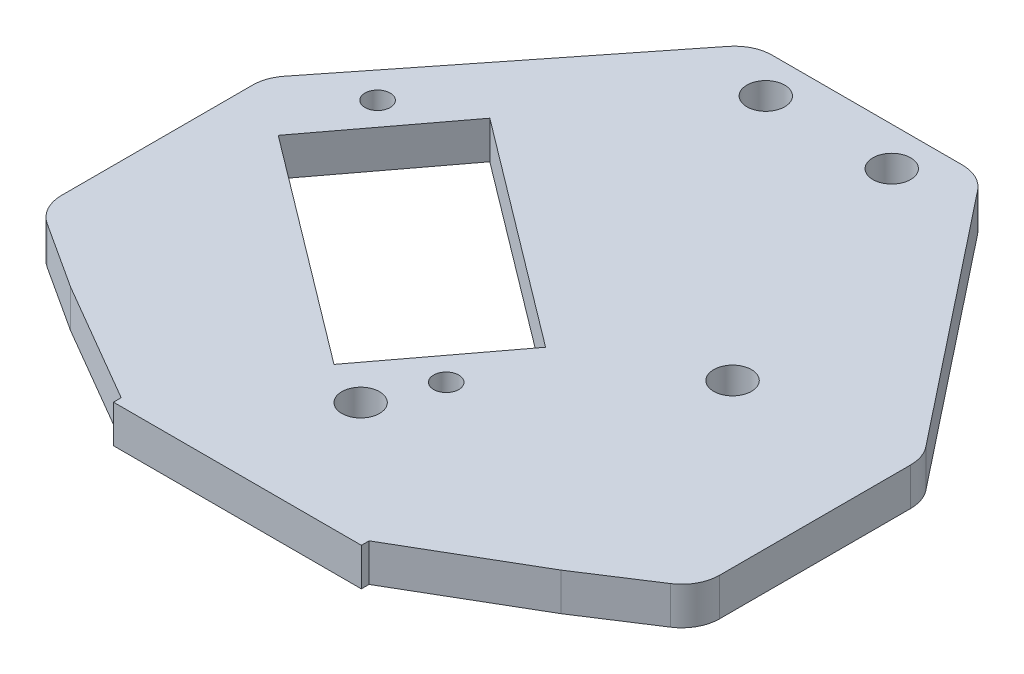
ISO-10303-21;
HEADER;
FILE_DESCRIPTION(('STEP AP214'),'2;1');
FILE_NAME('part.step','',(''),(''),'','','');
FILE_SCHEMA(('AUTOMOTIVE_DESIGN { 1 0 10303 214 1 1 1 1 }'));
ENDSEC;
DATA;
#1=APPLICATION_CONTEXT('core data for automotive mechanical design processes');
#2=APPLICATION_PROTOCOL_DEFINITION('international standard','automotive_design',2000,#1);
#3=PRODUCT_CONTEXT('',#1,'mechanical');
#4=PRODUCT('Part','Part','',(#3));
#5=PRODUCT_RELATED_PRODUCT_CATEGORY('part','',(#4));
#6=PRODUCT_DEFINITION_FORMATION('','',#4);
#7=PRODUCT_DEFINITION_CONTEXT('part definition',#1,'design');
#8=PRODUCT_DEFINITION('design','',#6,#7);
#9=PRODUCT_DEFINITION_SHAPE('','',#8);
#10=(LENGTH_UNIT() NAMED_UNIT(*) SI_UNIT(.MILLI.,.METRE.));
#11=(NAMED_UNIT(*) PLANE_ANGLE_UNIT() SI_UNIT($,.RADIAN.));
#12=(NAMED_UNIT(*) SI_UNIT($,.STERADIAN.) SOLID_ANGLE_UNIT());
#13=UNCERTAINTY_MEASURE_WITH_UNIT(LENGTH_MEASURE(1.E-05),#10,'distance_accuracy_value','');
#14=(GEOMETRIC_REPRESENTATION_CONTEXT(3) GLOBAL_UNCERTAINTY_ASSIGNED_CONTEXT((#13)) GLOBAL_UNIT_ASSIGNED_CONTEXT((#10,
#11,#12)) REPRESENTATION_CONTEXT('',''));
#15=CARTESIAN_POINT('',(0.,0.,0.));
#16=DIRECTION('',(0.,0.,1.));
#17=DIRECTION('',(1.,0.,0.));
#18=AXIS2_PLACEMENT_3D('',#15,#16,#17);
#19=CARTESIAN_POINT('',(0.,3.,0.));
#20=DIRECTION('',(0.,1.,0.));
#21=DIRECTION('',(0.,0.,1.));
#22=AXIS2_PLACEMENT_3D('',#19,#20,#21);
#23=PLANE('',#22);
#24=DIRECTION('',(1.,0.,0.));
#25=VECTOR('',#24,1.);
#26=CARTESIAN_POINT('',(0.,3.,12.4305224604994));
#27=LINE('',#26,#25);
#28=CARTESIAN_POINT('',(-9.84524580259062,3.,12.4305224604994));
#29=VERTEX_POINT('',#28);
#30=CARTESIAN_POINT('',(9.84524580259062,3.,12.4305224604994));
#31=VERTEX_POINT('',#30);
#32=EDGE_CURVE('E320',#29,#31,#27,.T.);
#33=ORIENTED_EDGE('',*,*,#32,.T.);
#34=DIRECTION('',(0.,0.,-1.));
#35=VECTOR('',#34,1.);
#36=CARTESIAN_POINT('',(9.84524580259062,3.,0.));
#37=LINE('',#36,#35);
#38=CARTESIAN_POINT('',(9.84524580259062,3.,11.8182002991371));
#39=VERTEX_POINT('',#38);
#40=EDGE_CURVE('E347',#31,#39,#37,.T.);
#41=ORIENTED_EDGE('',*,*,#40,.T.);
#42=DIRECTION('',(-0.864123910867607,0.,0.503279114077737));
#43=VECTOR('',#42,1.);
#44=CARTESIAN_POINT('',(7.63338331764616,3.,13.1064231776904));
#45=LINE('',#44,#43);
#46=CARTESIAN_POINT('',(19.4729223530017,3.,6.21089275448998));
#47=VERTEX_POINT('',#46);
#48=EDGE_CURVE('E328',#47,#39,#45,.T.);
#49=ORIENTED_EDGE('',*,*,#48,.F.);
#50=DIRECTION('',(-0.839060492785375,0.,0.54403813234622));
#51=VECTOR('',#50,1.);
#52=CARTESIAN_POINT('',(8.59870060585035,3.,13.2616254977275));
#53=LINE('',#52,#51);
#54=CARTESIAN_POINT('',(24.7620076801808,3.,2.78150461387315));
#55=VERTEX_POINT('',#54);
#56=EDGE_CURVE('E410',#55,#47,#53,.T.);
#57=ORIENTED_EDGE('',*,*,#56,.F.);
#58=CARTESIAN_POINT('',(23.1298932831421,3.,0.264323135517041));
#59=DIRECTION('',(0.,1.,0.));
#60=DIRECTION('',(0.,0.,1.));
#61=AXIS2_PLACEMENT_3D('',#58,#59,#60);
#62=CIRCLE('',#61,2.99999999999999);
#63=CARTESIAN_POINT('',(26.1298932831421,3.,0.264323135517023));
#64=VERTEX_POINT('',#63);
#65=EDGE_CURVE('E413',#64,#55,#62,.F.);
#66=ORIENTED_EDGE('',*,*,#65,.F.);
#67=DIRECTION('',(0.,0.,1.));
#68=VECTOR('',#67,1.);
#69=CARTESIAN_POINT('',(26.1298932831421,3.,0.));
#70=LINE('',#69,#68);
#71=CARTESIAN_POINT('',(26.1298932831421,3.,-14.9043713234961));
#72=VERTEX_POINT('',#71);
#73=EDGE_CURVE('E416',#72,#64,#70,.T.);
#74=ORIENTED_EDGE('',*,*,#73,.F.);
#75=CARTESIAN_POINT('',(23.1298932831421,3.,-14.9043713234962));
#76=DIRECTION('',(0.,1.,0.));
#77=DIRECTION('',(0.,0.,1.));
#78=AXIS2_PLACEMENT_3D('',#75,#76,#77);
#79=CIRCLE('',#78,3.);
#80=CARTESIAN_POINT('',(25.4825249080072,3.,-16.7658557950094));
#81=VERTEX_POINT('',#80);
#82=EDGE_CURVE('E419',#81,#72,#79,.F.);
#83=ORIENTED_EDGE('',*,*,#82,.F.);
#84=DIRECTION('',(0.620494823837742,0.,0.784210541621681));
#85=VECTOR('',#84,1.);
#86=CARTESIAN_POINT('',(23.8296421403781,3.,-18.8548467755022));
#87=LINE('',#86,#85);
#88=CARTESIAN_POINT('',(9.90251444278924,3.,-36.4566057835943));
#89=VERTEX_POINT('',#88);
#90=EDGE_CURVE('E422',#89,#81,#87,.T.);
#91=ORIENTED_EDGE('',*,*,#90,.F.);
#92=CARTESIAN_POINT('',(7.54988281792419,3.,-34.5951213120811));
#93=DIRECTION('',(0.,1.,0.));
#94=DIRECTION('',(0.,0.,1.));
#95=AXIS2_PLACEMENT_3D('',#92,#93,#94);
#96=CIRCLE('',#95,3.);
#97=CARTESIAN_POINT('',(7.54988281792418,3.,-37.5951213120811));
#98=VERTEX_POINT('',#97);
#99=EDGE_CURVE('E384',#98,#89,#96,.F.);
#100=ORIENTED_EDGE('',*,*,#99,.F.);
#101=DIRECTION('',(1.,0.,0.));
#102=VECTOR('',#101,1.);
#103=CARTESIAN_POINT('',(0.,3.,-37.595121312081));
#104=LINE('',#103,#102);
#105=CARTESIAN_POINT('',(-7.54988281792418,3.,-37.5951213120811));
#106=VERTEX_POINT('',#105);
#107=EDGE_CURVE('E388',#106,#98,#104,.T.);
#108=ORIENTED_EDGE('',*,*,#107,.F.);
#109=CARTESIAN_POINT('',(-7.54988281792419,3.,-34.5951213120811));
#110=DIRECTION('',(0.,1.,0.));
#111=DIRECTION('',(0.,0.,1.));
#112=AXIS2_PLACEMENT_3D('',#109,#110,#111);
#113=CIRCLE('',#112,3.);
#114=CARTESIAN_POINT('',(-9.90251444278924,3.,-36.4566057835943));
#115=VERTEX_POINT('',#114);
#116=EDGE_CURVE('E391',#106,#115,#113,.T.);
#117=ORIENTED_EDGE('',*,*,#116,.T.);
#118=DIRECTION('',(-0.620494823837742,0.,0.784210541621681));
#119=VECTOR('',#118,1.);
#120=CARTESIAN_POINT('',(-23.8296421403781,3.,-18.8548467755022));
#121=LINE('',#120,#119);
#122=CARTESIAN_POINT('',(-25.4825249080072,3.,-16.7658557950094));
#123=VERTEX_POINT('',#122);
#124=EDGE_CURVE('E393',#115,#123,#121,.T.);
#125=ORIENTED_EDGE('',*,*,#124,.T.);
#126=CARTESIAN_POINT('',(-23.1298932831421,3.,-14.9043713234962));
#127=DIRECTION('',(0.,1.,0.));
#128=DIRECTION('',(0.,0.,1.));
#129=AXIS2_PLACEMENT_3D('',#126,#127,#128);
#130=CIRCLE('',#129,3.);
#131=CARTESIAN_POINT('',(-26.1298932831421,3.,-14.9043713234961));
#132=VERTEX_POINT('',#131);
#133=EDGE_CURVE('E396',#123,#132,#130,.T.);
#134=ORIENTED_EDGE('',*,*,#133,.T.);
#135=DIRECTION('',(0.,0.,1.));
#136=VECTOR('',#135,1.);
#137=CARTESIAN_POINT('',(-26.1298932831421,3.,0.));
#138=LINE('',#137,#136);
#139=CARTESIAN_POINT('',(-26.1298932831421,3.,0.26432313551704));
#140=VERTEX_POINT('',#139);
#141=EDGE_CURVE('E399',#132,#140,#138,.T.);
#142=ORIENTED_EDGE('',*,*,#141,.T.);
#143=CARTESIAN_POINT('',(-23.1298932831421,3.,0.264323135517041));
#144=DIRECTION('',(0.,1.,0.));
#145=DIRECTION('',(0.,0.,1.));
#146=AXIS2_PLACEMENT_3D('',#143,#144,#145);
#147=CIRCLE('',#146,3.);
#148=CARTESIAN_POINT('',(-24.7620076801808,3.,2.78150461387317));
#149=VERTEX_POINT('',#148);
#150=EDGE_CURVE('E402',#140,#149,#147,.T.);
#151=ORIENTED_EDGE('',*,*,#150,.T.);
#152=DIRECTION('',(0.839060492785376,0.,0.544038132346218));
#153=VECTOR('',#152,1.);
#154=CARTESIAN_POINT('',(-8.59870060585031,3.,13.2616254977275));
#155=LINE('',#154,#153);
#156=CARTESIAN_POINT('',(-19.4729223530017,3.,6.21089275448998));
#157=VERTEX_POINT('',#156);
#158=EDGE_CURVE('E405',#149,#157,#155,.T.);
#159=ORIENTED_EDGE('',*,*,#158,.T.);
#160=DIRECTION('',(0.864123910867607,0.,0.503279114077737));
#161=VECTOR('',#160,1.);
#162=CARTESIAN_POINT('',(-7.63338331764616,3.,13.1064231776904));
#163=LINE('',#162,#161);
#164=CARTESIAN_POINT('',(-9.8452458025906,3.,11.8182002991371));
#165=VERTEX_POINT('',#164);
#166=EDGE_CURVE('E329',#157,#165,#163,.T.);
#167=ORIENTED_EDGE('',*,*,#166,.T.);
#168=DIRECTION('',(0.,0.,-1.));
#169=VECTOR('',#168,1.);
#170=CARTESIAN_POINT('',(-9.84524580259053,3.,46.7646735650199));
#171=LINE('',#170,#169);
#172=EDGE_CURVE('E334',#29,#165,#171,.T.);
#173=ORIENTED_EDGE('',*,*,#172,.F.);
#174=EDGE_LOOP('',(#33,#41,#49,#57,#66,#74,#83,#91,#100,#108,#117,#125,#134,#142,#151,#159,#167,#173));
#175=FACE_BOUND('',#174,.T.);
#176=DIRECTION('',(0.798635510047292,0.,0.601815023152049));
#177=VECTOR('',#176,1.);
#178=CARTESIAN_POINT('',(5.36964497979363,3.,-7.12575956437515));
#179=LINE('',#178,#177);
#180=CARTESIAN_POINT('',(-14.4326040358761,3.,-22.0478245112772));
#181=VERTEX_POINT('',#180);
#182=CARTESIAN_POINT('',(3.536694940188,3.,-8.50698649035606));
#183=VERTEX_POINT('',#182);
#184=EDGE_CURVE('E368',#181,#183,#179,.T.);
#185=ORIENTED_EDGE('',*,*,#184,.T.);
#186=DIRECTION('',(-0.601815023152049,0.,0.798635510047292));
#187=VECTOR('',#186,1.);
#188=CARTESIAN_POINT('',(-1.83295003960563,3.,-1.3812269259809));
#189=LINE('',#188,#187);
#190=CARTESIAN_POINT('',(-3.68508533763659,3.,1.07663963021145));
#191=VERTEX_POINT('',#190);
#192=EDGE_CURVE('E366',#183,#191,#189,.T.);
#193=ORIENTED_EDGE('',*,*,#192,.T.);
#194=DIRECTION('',(-0.798635510047292,0.,-0.601815023152049));
#195=VECTOR('',#194,1.);
#196=CARTESIAN_POINT('',(-1.85213529803096,3.,2.45786655619236));
#197=LINE('',#196,#195);
#198=CARTESIAN_POINT('',(-21.6543843137007,3.,-12.4641983907097));
#199=VERTEX_POINT('',#198);
#200=EDGE_CURVE('E194',#191,#199,#197,.T.);
#201=ORIENTED_EDGE('',*,*,#200,.T.);
#202=DIRECTION('',(0.60181502315205,0.,-0.798635510047292));
#203=VECTOR('',#202,1.);
#204=CARTESIAN_POINT('',(-19.8022490156697,3.,-14.922064946902));
#205=LINE('',#204,#203);
#206=EDGE_CURVE('E360',#199,#181,#205,.T.);
#207=ORIENTED_EDGE('',*,*,#206,.T.);
#208=EDGE_LOOP('',(#185,#193,#201,#207));
#209=FACE_BOUND('',#208,.T.);
#210=CARTESIAN_POINT('',(-20.1199465009113,3.,-18.8207305111888));
#211=DIRECTION('',(0.,1.,0.));
#212=DIRECTION('',(0.,0.,1.));
#213=AXIS2_PLACEMENT_3D('',#210,#211,#212);
#214=CIRCLE('',#213,1.);
#215=CARTESIAN_POINT('',(-20.1199465009113,3.,-17.8207305111888));
#216=VERTEX_POINT('',#215);
#217=EDGE_CURVE('E357',#216,#216,#214,.T.);
#218=ORIENTED_EDGE('',*,*,#217,.F.);
#219=EDGE_LOOP('',(#218));
#220=FACE_BOUND('',#219,.T.);
#221=CARTESIAN_POINT('',(5.00168111450462,3.,-34.5359042510216));
#222=DIRECTION('',(0.,1.,0.));
#223=DIRECTION('',(0.,0.,1.));
#224=AXIS2_PLACEMENT_3D('',#221,#222,#223);
#225=CIRCLE('',#224,1.5);
#226=CARTESIAN_POINT('',(5.00168111450462,3.,-33.0359042510216));
#227=VERTEX_POINT('',#226);
#228=EDGE_CURVE('E425',#227,#227,#225,.F.);
#229=ORIENTED_EDGE('',*,*,#228,.T.);
#230=EDGE_LOOP('',(#229));
#231=FACE_BOUND('',#230,.T.);
#232=CARTESIAN_POINT('',(-5.00168111450462,3.,-34.5359042510216));
#233=DIRECTION('',(0.,1.,0.));
#234=DIRECTION('',(0.,0.,1.));
#235=AXIS2_PLACEMENT_3D('',#232,#233,#234);
#236=CIRCLE('',#235,1.5);
#237=CARTESIAN_POINT('',(-5.00168111450462,3.,-33.0359042510216));
#238=VERTEX_POINT('',#237);
#239=EDGE_CURVE('E381',#238,#238,#236,.T.);
#240=ORIENTED_EDGE('',*,*,#239,.F.);
#241=EDGE_LOOP('',(#240));
#242=FACE_BOUND('',#241,.T.);
#243=CARTESIAN_POINT('',(2.00225712739866,3.,-2.15045436987698));
#244=DIRECTION('',(0.,1.,0.));
#245=DIRECTION('',(0.,0.,1.));
#246=AXIS2_PLACEMENT_3D('',#243,#244,#245);
#247=CIRCLE('',#246,1.);
#248=CARTESIAN_POINT('',(2.00225712739866,3.,-1.15045436987698));
#249=VERTEX_POINT('',#248);
#250=EDGE_CURVE('E361',#249,#249,#247,.T.);
#251=ORIENTED_EDGE('',*,*,#250,.F.);
#252=EDGE_LOOP('',(#251));
#253=FACE_BOUND('',#252,.T.);
#254=CARTESIAN_POINT('',(13.2516811145046,3.,-13.6459042510216));
#255=DIRECTION('',(0.,1.,0.));
#256=DIRECTION('',(0.,0.,1.));
#257=AXIS2_PLACEMENT_3D('',#254,#255,#256);
#258=CIRCLE('',#257,1.5);
#259=CARTESIAN_POINT('',(13.2516811145046,3.,-12.1459042510216));
#260=VERTEX_POINT('',#259);
#261=EDGE_CURVE('E353',#260,#260,#258,.T.);
#262=ORIENTED_EDGE('',*,*,#261,.F.);
#263=EDGE_LOOP('',(#262));
#264=FACE_BOUND('',#263,.T.);
#265=CARTESIAN_POINT('',(0.,3.,2.64299438612605));
#266=DIRECTION('',(0.,1.,0.));
#267=DIRECTION('',(0.,0.,1.));
#268=AXIS2_PLACEMENT_3D('',#265,#266,#267);
#269=CIRCLE('',#268,1.5);
#270=CARTESIAN_POINT('',(0.,3.,4.14299438612604));
#271=VERTEX_POINT('',#270);
#272=EDGE_CURVE('E349',#271,#271,#269,.T.);
#273=ORIENTED_EDGE('',*,*,#272,.F.);
#274=EDGE_LOOP('',(#273));
#275=FACE_BOUND('',#274,.T.);
#276=ADVANCED_FACE('F172',(#175,#209,#220,#231,#242,#253,#264,#275),#23,.T.);
#277=CARTESIAN_POINT('',(0.,0.,0.));
#278=DIRECTION('',(0.,1.,0.));
#279=DIRECTION('',(0.,0.,1.));
#280=AXIS2_PLACEMENT_3D('',#277,#278,#279);
#281=PLANE('',#280);
#282=DIRECTION('',(-0.601815023152049,0.,0.798635510047292));
#283=VECTOR('',#282,1.);
#284=CARTESIAN_POINT('',(-1.83295003960563,0.,-1.3812269259809));
#285=LINE('',#284,#283);
#286=CARTESIAN_POINT('',(3.536694940188,0.,-8.50698649035606));
#287=VERTEX_POINT('',#286);
#288=CARTESIAN_POINT('',(-3.68508533763659,0.,1.07663963021145));
#289=VERTEX_POINT('',#288);
#290=EDGE_CURVE('E519',#287,#289,#285,.T.);
#291=ORIENTED_EDGE('',*,*,#290,.F.);
#292=DIRECTION('',(0.798635510047292,0.,0.601815023152049));
#293=VECTOR('',#292,1.);
#294=CARTESIAN_POINT('',(5.36964497979363,0.,-7.12575956437515));
#295=LINE('',#294,#293);
#296=CARTESIAN_POINT('',(-14.4326040358761,0.,-22.0478245112772));
#297=VERTEX_POINT('',#296);
#298=EDGE_CURVE('E522',#297,#287,#295,.T.);
#299=ORIENTED_EDGE('',*,*,#298,.F.);
#300=DIRECTION('',(0.60181502315205,0.,-0.798635510047292));
#301=VECTOR('',#300,1.);
#302=CARTESIAN_POINT('',(-19.8022490156697,0.,-14.922064946902));
#303=LINE('',#302,#301);
#304=CARTESIAN_POINT('',(-21.6543843137007,0.,-12.4641983907097));
#305=VERTEX_POINT('',#304);
#306=EDGE_CURVE('E180',#305,#297,#303,.T.);
#307=ORIENTED_EDGE('',*,*,#306,.F.);
#308=DIRECTION('',(-0.798635510047292,0.,-0.601815023152049));
#309=VECTOR('',#308,1.);
#310=CARTESIAN_POINT('',(-1.85213529803096,0.,2.45786655619235));
#311=LINE('',#310,#309);
#312=EDGE_CURVE('E517',#289,#305,#311,.T.);
#313=ORIENTED_EDGE('',*,*,#312,.F.);
#314=EDGE_LOOP('',(#291,#299,#307,#313));
#315=FACE_BOUND('',#314,.T.);
#316=CARTESIAN_POINT('',(-20.1199465009113,0.,-18.8207305111888));
#317=DIRECTION('',(0.,1.,0.));
#318=DIRECTION('',(0.,0.,1.));
#319=AXIS2_PLACEMENT_3D('',#316,#317,#318);
#320=CIRCLE('',#319,1.);
#321=CARTESIAN_POINT('',(-20.1199465009113,0.,-17.8207305111888));
#322=VERTEX_POINT('',#321);
#323=EDGE_CURVE('E373',#322,#322,#320,.T.);
#324=ORIENTED_EDGE('',*,*,#323,.T.);
#325=EDGE_LOOP('',(#324));
#326=FACE_BOUND('',#325,.T.);
#327=DIRECTION('',(0.,0.,1.));
#328=VECTOR('',#327,1.);
#329=CARTESIAN_POINT('',(9.84524580259062,0.,0.));
#330=LINE('',#329,#328);
#331=CARTESIAN_POINT('',(9.84524580259062,0.,11.8182002991371));
#332=VERTEX_POINT('',#331);
#333=CARTESIAN_POINT('',(9.84524580259062,0.,12.4305224604994));
#334=VERTEX_POINT('',#333);
#335=EDGE_CURVE('E342',#332,#334,#330,.T.);
#336=ORIENTED_EDGE('',*,*,#335,.T.);
#337=DIRECTION('',(1.,0.,0.));
#338=VECTOR('',#337,1.);
#339=CARTESIAN_POINT('',(0.,0.,12.4305224604994));
#340=LINE('',#339,#338);
#341=CARTESIAN_POINT('',(-9.84524580259062,0.,12.4305224604994));
#342=VERTEX_POINT('',#341);
#343=EDGE_CURVE('E186',#342,#334,#340,.T.);
#344=ORIENTED_EDGE('',*,*,#343,.F.);
#345=DIRECTION('',(0.,0.,1.));
#346=VECTOR('',#345,1.);
#347=CARTESIAN_POINT('',(-9.84524580259062,0.,0.));
#348=LINE('',#347,#346);
#349=CARTESIAN_POINT('',(-9.84524580259062,0.,11.8182002991371));
#350=VERTEX_POINT('',#349);
#351=EDGE_CURVE('E337',#350,#342,#348,.T.);
#352=ORIENTED_EDGE('',*,*,#351,.F.);
#353=DIRECTION('',(0.864123910867607,0.,0.503279114077737));
#354=VECTOR('',#353,1.);
#355=CARTESIAN_POINT('',(-7.63338331764616,0.,13.1064231776904));
#356=LINE('',#355,#354);
#357=CARTESIAN_POINT('',(-19.4729223530017,0.,6.21089275448998));
#358=VERTEX_POINT('',#357);
#359=EDGE_CURVE('E457',#358,#350,#356,.T.);
#360=ORIENTED_EDGE('',*,*,#359,.F.);
#361=DIRECTION('',(0.839060492785376,0.,0.544038132346218));
#362=VECTOR('',#361,1.);
#363=CARTESIAN_POINT('',(-8.59870060585031,0.,13.2616254977275));
#364=LINE('',#363,#362);
#365=CARTESIAN_POINT('',(-24.7620076801808,0.,2.78150461387317));
#366=VERTEX_POINT('',#365);
#367=EDGE_CURVE('E454',#366,#358,#364,.T.);
#368=ORIENTED_EDGE('',*,*,#367,.F.);
#369=CARTESIAN_POINT('',(-23.1298932831421,0.,0.264323135517041));
#370=DIRECTION('',(0.,1.,0.));
#371=DIRECTION('',(0.,0.,1.));
#372=AXIS2_PLACEMENT_3D('',#369,#370,#371);
#373=CIRCLE('',#372,3.);
#374=CARTESIAN_POINT('',(-26.1298932831421,0.,0.26432313551704));
#375=VERTEX_POINT('',#374);
#376=EDGE_CURVE('E451',#375,#366,#373,.T.);
#377=ORIENTED_EDGE('',*,*,#376,.F.);
#378=DIRECTION('',(0.,0.,1.));
#379=VECTOR('',#378,1.);
#380=CARTESIAN_POINT('',(-26.1298932831421,0.,0.));
#381=LINE('',#380,#379);
#382=CARTESIAN_POINT('',(-26.1298932831421,0.,-14.9043713234961));
#383=VERTEX_POINT('',#382);
#384=EDGE_CURVE('E448',#383,#375,#381,.T.);
#385=ORIENTED_EDGE('',*,*,#384,.F.);
#386=CARTESIAN_POINT('',(-23.1298932831421,0.,-14.9043713234962));
#387=DIRECTION('',(0.,1.,0.));
#388=DIRECTION('',(0.,0.,1.));
#389=AXIS2_PLACEMENT_3D('',#386,#387,#388);
#390=CIRCLE('',#389,3.);
#391=CARTESIAN_POINT('',(-25.4825249080072,0.,-16.7658557950094));
#392=VERTEX_POINT('',#391);
#393=EDGE_CURVE('E445',#392,#383,#390,.T.);
#394=ORIENTED_EDGE('',*,*,#393,.F.);
#395=DIRECTION('',(-0.620494823837742,0.,0.784210541621681));
#396=VECTOR('',#395,1.);
#397=CARTESIAN_POINT('',(-23.8296421403781,0.,-18.8548467755022));
#398=LINE('',#397,#396);
#399=CARTESIAN_POINT('',(-9.90251444278924,0.,-36.4566057835943));
#400=VERTEX_POINT('',#399);
#401=EDGE_CURVE('E442',#400,#392,#398,.T.);
#402=ORIENTED_EDGE('',*,*,#401,.F.);
#403=CARTESIAN_POINT('',(-7.54988281792419,0.,-34.5951213120811));
#404=DIRECTION('',(0.,1.,0.));
#405=DIRECTION('',(0.,0.,1.));
#406=AXIS2_PLACEMENT_3D('',#403,#404,#405);
#407=CIRCLE('',#406,3.);
#408=CARTESIAN_POINT('',(-7.54988281792418,0.,-37.5951213120811));
#409=VERTEX_POINT('',#408);
#410=EDGE_CURVE('E439',#409,#400,#407,.T.);
#411=ORIENTED_EDGE('',*,*,#410,.F.);
#412=DIRECTION('',(1.,0.,0.));
#413=VECTOR('',#412,1.);
#414=CARTESIAN_POINT('',(0.,0.,-37.595121312081));
#415=LINE('',#414,#413);
#416=CARTESIAN_POINT('',(7.54988281792418,0.,-37.5951213120811));
#417=VERTEX_POINT('',#416);
#418=EDGE_CURVE('E436',#409,#417,#415,.T.);
#419=ORIENTED_EDGE('',*,*,#418,.T.);
#420=CARTESIAN_POINT('',(7.54988281792419,0.,-34.5951213120811));
#421=DIRECTION('',(0.,1.,0.));
#422=DIRECTION('',(0.,0.,1.));
#423=AXIS2_PLACEMENT_3D('',#420,#421,#422);
#424=CIRCLE('',#423,3.);
#425=CARTESIAN_POINT('',(9.90251444278924,0.,-36.4566057835943));
#426=VERTEX_POINT('',#425);
#427=EDGE_CURVE('E432',#417,#426,#424,.F.);
#428=ORIENTED_EDGE('',*,*,#427,.T.);
#429=DIRECTION('',(0.620494823837742,0.,0.784210541621681));
#430=VECTOR('',#429,1.);
#431=CARTESIAN_POINT('',(23.8296421403781,0.,-18.8548467755022));
#432=LINE('',#431,#430);
#433=CARTESIAN_POINT('',(25.4825249080072,0.,-16.7658557950094));
#434=VERTEX_POINT('',#433);
#435=EDGE_CURVE('E474',#426,#434,#432,.T.);
#436=ORIENTED_EDGE('',*,*,#435,.T.);
#437=CARTESIAN_POINT('',(23.1298932831421,0.,-14.9043713234962));
#438=DIRECTION('',(0.,1.,0.));
#439=DIRECTION('',(0.,0.,1.));
#440=AXIS2_PLACEMENT_3D('',#437,#438,#439);
#441=CIRCLE('',#440,3.);
#442=CARTESIAN_POINT('',(26.1298932831421,0.,-14.9043713234961));
#443=VERTEX_POINT('',#442);
#444=EDGE_CURVE('E471',#434,#443,#441,.F.);
#445=ORIENTED_EDGE('',*,*,#444,.T.);
#446=DIRECTION('',(0.,0.,1.));
#447=VECTOR('',#446,1.);
#448=CARTESIAN_POINT('',(26.1298932831421,0.,0.));
#449=LINE('',#448,#447);
#450=CARTESIAN_POINT('',(26.1298932831421,0.,0.264323135517023));
#451=VERTEX_POINT('',#450);
#452=EDGE_CURVE('E468',#443,#451,#449,.T.);
#453=ORIENTED_EDGE('',*,*,#452,.T.);
#454=CARTESIAN_POINT('',(23.1298932831421,0.,0.264323135517041));
#455=DIRECTION('',(0.,1.,0.));
#456=DIRECTION('',(0.,0.,1.));
#457=AXIS2_PLACEMENT_3D('',#454,#455,#456);
#458=CIRCLE('',#457,2.99999999999999);
#459=CARTESIAN_POINT('',(24.7620076801808,0.,2.78150461387315));
#460=VERTEX_POINT('',#459);
#461=EDGE_CURVE('E465',#451,#460,#458,.F.);
#462=ORIENTED_EDGE('',*,*,#461,.T.);
#463=DIRECTION('',(-0.839060492785375,0.,0.54403813234622));
#464=VECTOR('',#463,1.);
#465=CARTESIAN_POINT('',(8.59870060585035,0.,13.2616254977275));
#466=LINE('',#465,#464);
#467=CARTESIAN_POINT('',(19.4729223530017,0.,6.21089275448998));
#468=VERTEX_POINT('',#467);
#469=EDGE_CURVE('E462',#460,#468,#466,.T.);
#470=ORIENTED_EDGE('',*,*,#469,.T.);
#471=DIRECTION('',(-0.864123910867607,0.,0.503279114077737));
#472=VECTOR('',#471,1.);
#473=CARTESIAN_POINT('',(7.63338331764616,0.,13.1064231776904));
#474=LINE('',#473,#472);
#475=EDGE_CURVE('E460',#468,#332,#474,.T.);
#476=ORIENTED_EDGE('',*,*,#475,.T.);
#477=EDGE_LOOP('',(#336,#344,#352,#360,#368,#377,#385,#394,#402,#411,#419,#428,#436,#445,#453,
#462,#470,#476));
#478=FACE_BOUND('',#477,.T.);
#479=CARTESIAN_POINT('',(0.,0.,2.64299438612605));
#480=DIRECTION('',(0.,1.,0.));
#481=DIRECTION('',(0.,0.,1.));
#482=AXIS2_PLACEMENT_3D('',#479,#480,#481);
#483=CIRCLE('',#482,1.5);
#484=CARTESIAN_POINT('',(0.,0.,4.14299438612604));
#485=VERTEX_POINT('',#484);
#486=EDGE_CURVE('E352',#485,#485,#483,.T.);
#487=ORIENTED_EDGE('',*,*,#486,.T.);
#488=EDGE_LOOP('',(#487));
#489=FACE_BOUND('',#488,.T.);
#490=CARTESIAN_POINT('',(2.00225712739866,0.,-2.15045436987698));
#491=DIRECTION('',(0.,1.,0.));
#492=DIRECTION('',(0.,0.,1.));
#493=AXIS2_PLACEMENT_3D('',#490,#491,#492);
#494=CIRCLE('',#493,1.);
#495=CARTESIAN_POINT('',(2.00225712739866,0.,-1.15045436987698));
#496=VERTEX_POINT('',#495);
#497=EDGE_CURVE('E433',#496,#496,#494,.T.);
#498=ORIENTED_EDGE('',*,*,#497,.T.);
#499=EDGE_LOOP('',(#498));
#500=FACE_BOUND('',#499,.T.);
#501=CARTESIAN_POINT('',(5.00168111450462,0.,-34.5359042510216));
#502=DIRECTION('',(0.,1.,0.));
#503=DIRECTION('',(0.,0.,1.));
#504=AXIS2_PLACEMENT_3D('',#501,#502,#503);
#505=CIRCLE('',#504,1.5);
#506=CARTESIAN_POINT('',(5.00168111450462,0.,-33.0359042510216));
#507=VERTEX_POINT('',#506);
#508=EDGE_CURVE('E385',#507,#507,#505,.F.);
#509=ORIENTED_EDGE('',*,*,#508,.F.);
#510=EDGE_LOOP('',(#509));
#511=FACE_BOUND('',#510,.T.);
#512=CARTESIAN_POINT('',(-5.00168111450462,0.,-34.5359042510216));
#513=DIRECTION('',(0.,1.,0.));
#514=DIRECTION('',(0.,0.,1.));
#515=AXIS2_PLACEMENT_3D('',#512,#513,#514);
#516=CIRCLE('',#515,1.5);
#517=CARTESIAN_POINT('',(-5.00168111450462,0.,-33.0359042510216));
#518=VERTEX_POINT('',#517);
#519=EDGE_CURVE('E429',#518,#518,#516,.T.);
#520=ORIENTED_EDGE('',*,*,#519,.T.);
#521=EDGE_LOOP('',(#520));
#522=FACE_BOUND('',#521,.T.);
#523=CARTESIAN_POINT('',(13.2516811145046,0.,-13.6459042510216));
#524=DIRECTION('',(0.,1.,0.));
#525=DIRECTION('',(0.,0.,1.));
#526=AXIS2_PLACEMENT_3D('',#523,#524,#525);
#527=CIRCLE('',#526,1.5);
#528=CARTESIAN_POINT('',(13.2516811145046,0.,-12.1459042510216));
#529=VERTEX_POINT('',#528);
#530=EDGE_CURVE('E356',#529,#529,#527,.T.);
#531=ORIENTED_EDGE('',*,*,#530,.T.);
#532=EDGE_LOOP('',(#531));
#533=FACE_BOUND('',#532,.T.);
#534=ADVANCED_FACE('F533',(#315,#326,#478,#489,#500,#511,#522,#533),#281,.F.);
#535=CARTESIAN_POINT('',(-9.84524580259062,3.,0.));
#536=DIRECTION('',(1.,0.,0.));
#537=DIRECTION('',(0.,0.,-1.));
#538=AXIS2_PLACEMENT_3D('',#535,#536,#537);
#539=PLANE('',#538);
#540=ORIENTED_EDGE('',*,*,#351,.T.);
#541=DIRECTION('',(0.,1.,0.));
#542=VECTOR('',#541,1.);
#543=CARTESIAN_POINT('',(-9.84524580259062,3.,12.4305224604994));
#544=LINE('',#543,#542);
#545=EDGE_CURVE('E323',#342,#29,#544,.T.);
#546=ORIENTED_EDGE('',*,*,#545,.T.);
#547=ORIENTED_EDGE('',*,*,#172,.T.);
#548=DIRECTION('',(0.,-1.,0.));
#549=VECTOR('',#548,1.);
#550=CARTESIAN_POINT('',(-9.84524580259062,3.,11.8182002991371));
#551=LINE('',#550,#549);
#552=EDGE_CURVE('E493',#165,#350,#551,.T.);
#553=ORIENTED_EDGE('',*,*,#552,.T.);
#554=EDGE_LOOP('',(#540,#546,#547,#553));
#555=FACE_BOUND('',#554,.T.);
#556=ADVANCED_FACE('F332',(#555),#539,.F.);
#557=CARTESIAN_POINT('',(7.54988281792419,3.,-34.5951213120811));
#558=DIRECTION('',(0.,-1.,0.));
#559=DIRECTION('',(0.,0.,-1.));
#560=AXIS2_PLACEMENT_3D('',#557,#558,#559);
#561=CYLINDRICAL_SURFACE('',#560,3.);
#562=ORIENTED_EDGE('',*,*,#427,.F.);
#563=DIRECTION('',(0.,-1.,0.));
#564=VECTOR('',#563,1.);
#565=CARTESIAN_POINT('',(7.54988281792418,3.,-37.5951213120811));
#566=LINE('',#565,#564);
#567=EDGE_CURVE('E515',#98,#417,#566,.T.);
#568=ORIENTED_EDGE('',*,*,#567,.F.);
#569=ORIENTED_EDGE('',*,*,#99,.T.);
#570=DIRECTION('',(0.,-1.,0.));
#571=VECTOR('',#570,1.);
#572=CARTESIAN_POINT('',(9.90251444278924,3.,-36.4566057835943));
#573=LINE('',#572,#571);
#574=EDGE_CURVE('E428',#89,#426,#573,.T.);
#575=ORIENTED_EDGE('',*,*,#574,.T.);
#576=EDGE_LOOP('',(#562,#568,#569,#575));
#577=FACE_BOUND('',#576,.T.);
#578=ADVANCED_FACE('F595',(#577),#561,.T.);
#579=CARTESIAN_POINT('',(0.,3.,-37.595121312081));
#580=DIRECTION('',(0.,0.,-1.));
#581=DIRECTION('',(-1.,0.,0.));
#582=AXIS2_PLACEMENT_3D('',#579,#580,#581);
#583=PLANE('',#582);
#584=ORIENTED_EDGE('',*,*,#418,.F.);
#585=DIRECTION('',(0.,-1.,0.));
#586=VECTOR('',#585,1.);
#587=CARTESIAN_POINT('',(-7.54988281792418,3.,-37.5951213120811));
#588=LINE('',#587,#586);
#589=EDGE_CURVE('E513',#106,#409,#588,.T.);
#590=ORIENTED_EDGE('',*,*,#589,.F.);
#591=ORIENTED_EDGE('',*,*,#107,.T.);
#592=ORIENTED_EDGE('',*,*,#567,.T.);
#593=EDGE_LOOP('',(#584,#590,#591,#592));
#594=FACE_BOUND('',#593,.T.);
#595=ADVANCED_FACE('F622',(#594),#583,.T.);
#596=CARTESIAN_POINT('',(-7.54988281792419,3.,-34.5951213120811));
#597=DIRECTION('',(0.,-1.,0.));
#598=DIRECTION('',(0.,0.,-1.));
#599=AXIS2_PLACEMENT_3D('',#596,#597,#598);
#600=CYLINDRICAL_SURFACE('',#599,3.);
#601=ORIENTED_EDGE('',*,*,#410,.T.);
#602=DIRECTION('',(0.,-1.,0.));
#603=VECTOR('',#602,1.);
#604=CARTESIAN_POINT('',(-9.90251444278924,3.,-36.4566057835943));
#605=LINE('',#604,#603);
#606=EDGE_CURVE('E510',#115,#400,#605,.T.);
#607=ORIENTED_EDGE('',*,*,#606,.F.);
#608=ORIENTED_EDGE('',*,*,#116,.F.);
#609=ORIENTED_EDGE('',*,*,#589,.T.);
#610=EDGE_LOOP('',(#601,#607,#608,#609));
#611=FACE_BOUND('',#610,.T.);
#612=ADVANCED_FACE('F618',(#611),#600,.T.);
#613=CARTESIAN_POINT('',(-23.8296421403781,3.,-18.8548467755022));
#614=DIRECTION('',(0.784210541621681,0.,0.620494823837742));
#615=DIRECTION('',(0.620494823837742,0.,-0.784210541621681));
#616=AXIS2_PLACEMENT_3D('',#613,#614,#615);
#617=PLANE('',#616);
#618=ORIENTED_EDGE('',*,*,#401,.T.);
#619=DIRECTION('',(0.,-1.,0.));
#620=VECTOR('',#619,1.);
#621=CARTESIAN_POINT('',(-25.4825249080072,3.,-16.7658557950094));
#622=LINE('',#621,#620);
#623=EDGE_CURVE('E507',#123,#392,#622,.T.);
#624=ORIENTED_EDGE('',*,*,#623,.F.);
#625=ORIENTED_EDGE('',*,*,#124,.F.);
#626=ORIENTED_EDGE('',*,*,#606,.T.);
#627=EDGE_LOOP('',(#618,#624,#625,#626));
#628=FACE_BOUND('',#627,.T.);
#629=ADVANCED_FACE('F614',(#628),#617,.F.);
#630=CARTESIAN_POINT('',(-23.1298932831421,3.,-14.9043713234962));
#631=DIRECTION('',(0.,-1.,0.));
#632=DIRECTION('',(0.,0.,-1.));
#633=AXIS2_PLACEMENT_3D('',#630,#631,#632);
#634=CYLINDRICAL_SURFACE('',#633,3.);
#635=ORIENTED_EDGE('',*,*,#393,.T.);
#636=DIRECTION('',(0.,-1.,0.));
#637=VECTOR('',#636,1.);
#638=CARTESIAN_POINT('',(-26.1298932831421,3.,-14.9043713234961));
#639=LINE('',#638,#637);
#640=EDGE_CURVE('E504',#132,#383,#639,.T.);
#641=ORIENTED_EDGE('',*,*,#640,.F.);
#642=ORIENTED_EDGE('',*,*,#133,.F.);
#643=ORIENTED_EDGE('',*,*,#623,.T.);
#644=EDGE_LOOP('',(#635,#641,#642,#643));
#645=FACE_BOUND('',#644,.T.);
#646=ADVANCED_FACE('F610',(#645),#634,.T.);
#647=CARTESIAN_POINT('',(-26.1298932831421,3.,0.));
#648=DIRECTION('',(1.,0.,0.));
#649=DIRECTION('',(0.,0.,-1.));
#650=AXIS2_PLACEMENT_3D('',#647,#648,#649);
#651=PLANE('',#650);
#652=ORIENTED_EDGE('',*,*,#384,.T.);
#653=DIRECTION('',(0.,-1.,0.));
#654=VECTOR('',#653,1.);
#655=CARTESIAN_POINT('',(-26.1298932831421,3.,0.26432313551704));
#656=LINE('',#655,#654);
#657=EDGE_CURVE('E501',#140,#375,#656,.T.);
#658=ORIENTED_EDGE('',*,*,#657,.F.);
#659=ORIENTED_EDGE('',*,*,#141,.F.);
#660=ORIENTED_EDGE('',*,*,#640,.T.);
#661=EDGE_LOOP('',(#652,#658,#659,#660));
#662=FACE_BOUND('',#661,.T.);
#663=ADVANCED_FACE('F606',(#662),#651,.F.);
#664=CARTESIAN_POINT('',(-23.1298932831421,3.,0.264323135517041));
#665=DIRECTION('',(0.,-1.,0.));
#666=DIRECTION('',(0.,0.,-1.));
#667=AXIS2_PLACEMENT_3D('',#664,#665,#666);
#668=CYLINDRICAL_SURFACE('',#667,3.);
#669=ORIENTED_EDGE('',*,*,#376,.T.);
#670=DIRECTION('',(0.,-1.,0.));
#671=VECTOR('',#670,1.);
#672=CARTESIAN_POINT('',(-24.7620076801808,3.,2.78150461387317));
#673=LINE('',#672,#671);
#674=EDGE_CURVE('E498',#149,#366,#673,.T.);
#675=ORIENTED_EDGE('',*,*,#674,.F.);
#676=ORIENTED_EDGE('',*,*,#150,.F.);
#677=ORIENTED_EDGE('',*,*,#657,.T.);
#678=EDGE_LOOP('',(#669,#675,#676,#677));
#679=FACE_BOUND('',#678,.T.);
#680=ADVANCED_FACE('F602',(#679),#668,.T.);
#681=CARTESIAN_POINT('',(-8.59870060585031,3.,13.2616254977275));
#682=DIRECTION('',(0.544038132346218,0.,-0.839060492785376));
#683=DIRECTION('',(-0.839060492785376,0.,-0.544038132346218));
#684=AXIS2_PLACEMENT_3D('',#681,#682,#683);
#685=PLANE('',#684);
#686=ORIENTED_EDGE('',*,*,#367,.T.);
#687=DIRECTION('',(0.,-1.,0.));
#688=VECTOR('',#687,1.);
#689=CARTESIAN_POINT('',(-19.4729223530017,3.,6.21089275448998));
#690=LINE('',#689,#688);
#691=EDGE_CURVE('E495',#157,#358,#690,.T.);
#692=ORIENTED_EDGE('',*,*,#691,.F.);
#693=ORIENTED_EDGE('',*,*,#158,.F.);
#694=ORIENTED_EDGE('',*,*,#674,.T.);
#695=EDGE_LOOP('',(#686,#692,#693,#694));
#696=FACE_BOUND('',#695,.T.);
#697=ADVANCED_FACE('F598',(#696),#685,.F.);
#698=CARTESIAN_POINT('',(-7.63338331764616,3.,13.1064231776904));
#699=DIRECTION('',(0.503279114077737,0.,-0.864123910867607));
#700=DIRECTION('',(-0.864123910867607,0.,-0.503279114077737));
#701=AXIS2_PLACEMENT_3D('',#698,#699,#700);
#702=PLANE('',#701);
#703=ORIENTED_EDGE('',*,*,#359,.T.);
#704=ORIENTED_EDGE('',*,*,#552,.F.);
#705=ORIENTED_EDGE('',*,*,#166,.F.);
#706=ORIENTED_EDGE('',*,*,#691,.T.);
#707=EDGE_LOOP('',(#703,#704,#705,#706));
#708=FACE_BOUND('',#707,.T.);
#709=ADVANCED_FACE('F592',(#708),#702,.F.);
#710=CARTESIAN_POINT('',(0.,3.,12.4305224604994));
#711=DIRECTION('',(0.,0.,-1.));
#712=DIRECTION('',(-1.,0.,0.));
#713=AXIS2_PLACEMENT_3D('',#710,#711,#712);
#714=PLANE('',#713);
#715=ORIENTED_EDGE('',*,*,#343,.T.);
#716=DIRECTION('',(0.,1.,0.));
#717=VECTOR('',#716,1.);
#718=CARTESIAN_POINT('',(9.84524580259062,3.,12.4305224604994));
#719=LINE('',#718,#717);
#720=EDGE_CURVE('E12',#334,#31,#719,.T.);
#721=ORIENTED_EDGE('',*,*,#720,.T.);
#722=ORIENTED_EDGE('',*,*,#32,.F.);
#723=ORIENTED_EDGE('',*,*,#545,.F.);
#724=EDGE_LOOP('',(#715,#721,#722,#723));
#725=FACE_BOUND('',#724,.T.);
#726=ADVANCED_FACE('F322',(#725),#714,.F.);
#727=CARTESIAN_POINT('',(9.84524580259062,3.,0.));
#728=DIRECTION('',(1.,0.,0.));
#729=DIRECTION('',(0.,0.,-1.));
#730=AXIS2_PLACEMENT_3D('',#727,#728,#729);
#731=PLANE('',#730);
#732=ORIENTED_EDGE('',*,*,#720,.F.);
#733=ORIENTED_EDGE('',*,*,#335,.F.);
#734=DIRECTION('',(0.,-1.,0.));
#735=VECTOR('',#734,1.);
#736=CARTESIAN_POINT('',(9.84524580259062,3.,11.8182002991371));
#737=LINE('',#736,#735);
#738=EDGE_CURVE('E490',#39,#332,#737,.T.);
#739=ORIENTED_EDGE('',*,*,#738,.F.);
#740=ORIENTED_EDGE('',*,*,#40,.F.);
#741=EDGE_LOOP('',(#732,#733,#739,#740));
#742=FACE_BOUND('',#741,.T.);
#743=ADVANCED_FACE('F585',(#742),#731,.T.);
#744=CARTESIAN_POINT('',(7.63338331764616,3.,13.1064231776904));
#745=DIRECTION('',(0.503279114077737,0.,0.864123910867607));
#746=DIRECTION('',(0.864123910867607,0.,-0.503279114077737));
#747=AXIS2_PLACEMENT_3D('',#744,#745,#746);
#748=PLANE('',#747);
#749=ORIENTED_EDGE('',*,*,#475,.F.);
#750=DIRECTION('',(0.,-1.,0.));
#751=VECTOR('',#750,1.);
#752=CARTESIAN_POINT('',(19.4729223530017,3.,6.21089275448998));
#753=LINE('',#752,#751);
#754=EDGE_CURVE('E488',#47,#468,#753,.T.);
#755=ORIENTED_EDGE('',*,*,#754,.F.);
#756=ORIENTED_EDGE('',*,*,#48,.T.);
#757=ORIENTED_EDGE('',*,*,#738,.T.);
#758=EDGE_LOOP('',(#749,#755,#756,#757));
#759=FACE_BOUND('',#758,.T.);
#760=ADVANCED_FACE('F581',(#759),#748,.T.);
#761=CARTESIAN_POINT('',(8.59870060585035,3.,13.2616254977275));
#762=DIRECTION('',(0.54403813234622,0.,0.839060492785375));
#763=DIRECTION('',(0.839060492785375,0.,-0.54403813234622));
#764=AXIS2_PLACEMENT_3D('',#761,#762,#763);
#765=PLANE('',#764);
#766=ORIENTED_EDGE('',*,*,#469,.F.);
#767=DIRECTION('',(0.,-1.,0.));
#768=VECTOR('',#767,1.);
#769=CARTESIAN_POINT('',(24.7620076801808,3.,2.78150461387315));
#770=LINE('',#769,#768);
#771=EDGE_CURVE('E486',#55,#460,#770,.T.);
#772=ORIENTED_EDGE('',*,*,#771,.F.);
#773=ORIENTED_EDGE('',*,*,#56,.T.);
#774=ORIENTED_EDGE('',*,*,#754,.T.);
#775=EDGE_LOOP('',(#766,#772,#773,#774));
#776=FACE_BOUND('',#775,.T.);
#777=ADVANCED_FACE('F577',(#776),#765,.T.);
#778=CARTESIAN_POINT('',(23.1298932831421,3.,0.264323135517041));
#779=DIRECTION('',(0.,-1.,0.));
#780=DIRECTION('',(0.,0.,-1.));
#781=AXIS2_PLACEMENT_3D('',#778,#779,#780);
#782=CYLINDRICAL_SURFACE('',#781,2.99999999999999);
#783=ORIENTED_EDGE('',*,*,#461,.F.);
#784=DIRECTION('',(0.,-1.,0.));
#785=VECTOR('',#784,1.);
#786=CARTESIAN_POINT('',(26.1298932831421,3.,0.264323135517023));
#787=LINE('',#786,#785);
#788=EDGE_CURVE('E484',#64,#451,#787,.T.);
#789=ORIENTED_EDGE('',*,*,#788,.F.);
#790=ORIENTED_EDGE('',*,*,#65,.T.);
#791=ORIENTED_EDGE('',*,*,#771,.T.);
#792=EDGE_LOOP('',(#783,#789,#790,#791));
#793=FACE_BOUND('',#792,.T.);
#794=ADVANCED_FACE('F573',(#793),#782,.T.);
#795=CARTESIAN_POINT('',(26.1298932831421,3.,0.));
#796=DIRECTION('',(1.,0.,0.));
#797=DIRECTION('',(0.,0.,-1.));
#798=AXIS2_PLACEMENT_3D('',#795,#796,#797);
#799=PLANE('',#798);
#800=ORIENTED_EDGE('',*,*,#452,.F.);
#801=DIRECTION('',(0.,-1.,0.));
#802=VECTOR('',#801,1.);
#803=CARTESIAN_POINT('',(26.1298932831421,3.,-14.9043713234961));
#804=LINE('',#803,#802);
#805=EDGE_CURVE('E482',#72,#443,#804,.T.);
#806=ORIENTED_EDGE('',*,*,#805,.F.);
#807=ORIENTED_EDGE('',*,*,#73,.T.);
#808=ORIENTED_EDGE('',*,*,#788,.T.);
#809=EDGE_LOOP('',(#800,#806,#807,#808));
#810=FACE_BOUND('',#809,.T.);
#811=ADVANCED_FACE('F569',(#810),#799,.T.);
#812=CARTESIAN_POINT('',(23.1298932831421,3.,-14.9043713234962));
#813=DIRECTION('',(0.,-1.,0.));
#814=DIRECTION('',(0.,0.,-1.));
#815=AXIS2_PLACEMENT_3D('',#812,#813,#814);
#816=CYLINDRICAL_SURFACE('',#815,3.);
#817=ORIENTED_EDGE('',*,*,#444,.F.);
#818=DIRECTION('',(0.,-1.,0.));
#819=VECTOR('',#818,1.);
#820=CARTESIAN_POINT('',(25.4825249080072,3.,-16.7658557950094));
#821=LINE('',#820,#819);
#822=EDGE_CURVE('E480',#81,#434,#821,.T.);
#823=ORIENTED_EDGE('',*,*,#822,.F.);
#824=ORIENTED_EDGE('',*,*,#82,.T.);
#825=ORIENTED_EDGE('',*,*,#805,.T.);
#826=EDGE_LOOP('',(#817,#823,#824,#825));
#827=FACE_BOUND('',#826,.T.);
#828=ADVANCED_FACE('F565',(#827),#816,.T.);
#829=CARTESIAN_POINT('',(23.8296421403781,3.,-18.8548467755022));
#830=DIRECTION('',(0.784210541621681,0.,-0.620494823837742));
#831=DIRECTION('',(-0.620494823837742,0.,-0.784210541621681));
#832=AXIS2_PLACEMENT_3D('',#829,#830,#831);
#833=PLANE('',#832);
#834=ORIENTED_EDGE('',*,*,#435,.F.);
#835=ORIENTED_EDGE('',*,*,#574,.F.);
#836=ORIENTED_EDGE('',*,*,#90,.T.);
#837=ORIENTED_EDGE('',*,*,#822,.T.);
#838=EDGE_LOOP('',(#834,#835,#836,#837));
#839=FACE_BOUND('',#838,.T.);
#840=ADVANCED_FACE('F562',(#839),#833,.T.);
#841=CARTESIAN_POINT('',(-5.00168111450462,3.,-34.5359042510216));
#842=DIRECTION('',(0.,-1.,0.));
#843=DIRECTION('',(0.,0.,-1.));
#844=AXIS2_PLACEMENT_3D('',#841,#842,#843);
#845=CYLINDRICAL_SURFACE('',#844,1.5);
#846=ORIENTED_EDGE('',*,*,#239,.T.);
#847=EDGE_LOOP('',(#846));
#848=FACE_BOUND('',#847,.T.);
#849=ORIENTED_EDGE('',*,*,#519,.F.);
#850=EDGE_LOOP('',(#849));
#851=FACE_BOUND('',#850,.T.);
#852=ADVANCED_FACE('F174',(#848,#851),#845,.F.);
#853=CARTESIAN_POINT('',(5.00168111450462,3.,-34.5359042510216));
#854=DIRECTION('',(0.,-1.,0.));
#855=DIRECTION('',(0.,0.,-1.));
#856=AXIS2_PLACEMENT_3D('',#853,#854,#855);
#857=CYLINDRICAL_SURFACE('',#856,1.5);
#858=ORIENTED_EDGE('',*,*,#228,.F.);
#859=EDGE_LOOP('',(#858));
#860=FACE_BOUND('',#859,.T.);
#861=ORIENTED_EDGE('',*,*,#508,.T.);
#862=EDGE_LOOP('',(#861));
#863=FACE_BOUND('',#862,.T.);
#864=ADVANCED_FACE('F558',(#860,#863),#857,.F.);
#865=CARTESIAN_POINT('',(-19.8022490156697,-7.,-14.922064946902));
#866=DIRECTION('',(0.798635510047292,0.,0.60181502315205));
#867=DIRECTION('',(0.60181502315205,0.,-0.798635510047292));
#868=AXIS2_PLACEMENT_3D('',#865,#866,#867);
#869=PLANE('',#868);
#870=ORIENTED_EDGE('',*,*,#306,.T.);
#871=DIRECTION('',(0.,1.,0.));
#872=VECTOR('',#871,1.);
#873=CARTESIAN_POINT('',(-14.4326040358761,-7.,-22.0478245112772));
#874=LINE('',#873,#872);
#875=EDGE_CURVE('E371',#297,#181,#874,.T.);
#876=ORIENTED_EDGE('',*,*,#875,.T.);
#877=ORIENTED_EDGE('',*,*,#206,.F.);
#878=DIRECTION('',(0.,1.,0.));
#879=VECTOR('',#878,1.);
#880=CARTESIAN_POINT('',(-21.6543843137007,-7.,-12.4641983907097));
#881=LINE('',#880,#879);
#882=EDGE_CURVE('E370',#305,#199,#881,.T.);
#883=ORIENTED_EDGE('',*,*,#882,.F.);
#884=EDGE_LOOP('',(#870,#876,#877,#883));
#885=FACE_BOUND('',#884,.T.);
#886=ADVANCED_FACE('F555',(#885),#869,.T.);
#887=CARTESIAN_POINT('',(5.36964497979363,-7.,-7.12575956437515));
#888=DIRECTION('',(-0.601815023152049,0.,0.798635510047292));
#889=DIRECTION('',(0.798635510047292,0.,0.601815023152049));
#890=AXIS2_PLACEMENT_3D('',#887,#888,#889);
#891=PLANE('',#890);
#892=ORIENTED_EDGE('',*,*,#298,.T.);
#893=DIRECTION('',(0.,1.,0.));
#894=VECTOR('',#893,1.);
#895=CARTESIAN_POINT('',(3.536694940188,-7.,-8.50698649035606));
#896=LINE('',#895,#894);
#897=EDGE_CURVE('E374',#287,#183,#896,.T.);
#898=ORIENTED_EDGE('',*,*,#897,.T.);
#899=ORIENTED_EDGE('',*,*,#184,.F.);
#900=ORIENTED_EDGE('',*,*,#875,.F.);
#901=EDGE_LOOP('',(#892,#898,#899,#900));
#902=FACE_BOUND('',#901,.T.);
#903=ADVANCED_FACE('F741',(#902),#891,.T.);
#904=CARTESIAN_POINT('',(-1.83295003960563,-7.,-1.3812269259809));
#905=DIRECTION('',(-0.798635510047292,0.,-0.601815023152049));
#906=DIRECTION('',(-0.601815023152049,0.,0.798635510047292));
#907=AXIS2_PLACEMENT_3D('',#904,#905,#906);
#908=PLANE('',#907);
#909=ORIENTED_EDGE('',*,*,#290,.T.);
#910=DIRECTION('',(0.,1.,0.));
#911=VECTOR('',#910,1.);
#912=CARTESIAN_POINT('',(-3.68508533763659,-7.,1.07663963021145));
#913=LINE('',#912,#911);
#914=EDGE_CURVE('E377',#289,#191,#913,.T.);
#915=ORIENTED_EDGE('',*,*,#914,.T.);
#916=ORIENTED_EDGE('',*,*,#192,.F.);
#917=ORIENTED_EDGE('',*,*,#897,.F.);
#918=EDGE_LOOP('',(#909,#915,#916,#917));
#919=FACE_BOUND('',#918,.T.);
#920=ADVANCED_FACE('F748',(#919),#908,.T.);
#921=CARTESIAN_POINT('',(-1.85213529803096,-7.,2.45786655619236));
#922=DIRECTION('',(0.601815023152049,0.,-0.798635510047292));
#923=DIRECTION('',(-0.798635510047292,0.,-0.601815023152049));
#924=AXIS2_PLACEMENT_3D('',#921,#922,#923);
#925=PLANE('',#924);
#926=ORIENTED_EDGE('',*,*,#312,.T.);
#927=ORIENTED_EDGE('',*,*,#882,.T.);
#928=ORIENTED_EDGE('',*,*,#200,.F.);
#929=ORIENTED_EDGE('',*,*,#914,.F.);
#930=EDGE_LOOP('',(#926,#927,#928,#929));
#931=FACE_BOUND('',#930,.T.);
#932=ADVANCED_FACE('F756',(#931),#925,.T.);
#933=CARTESIAN_POINT('',(-20.1199465009113,-7.,-18.8207305111888));
#934=DIRECTION('',(0.,1.,0.));
#935=DIRECTION('',(0.,0.,1.));
#936=AXIS2_PLACEMENT_3D('',#933,#934,#935);
#937=CYLINDRICAL_SURFACE('',#936,1.);
#938=ORIENTED_EDGE('',*,*,#217,.T.);
#939=EDGE_LOOP('',(#938));
#940=FACE_BOUND('',#939,.T.);
#941=ORIENTED_EDGE('',*,*,#323,.F.);
#942=EDGE_LOOP('',(#941));
#943=FACE_BOUND('',#942,.T.);
#944=ADVANCED_FACE('F764',(#940,#943),#937,.F.);
#945=CARTESIAN_POINT('',(2.00225712739866,-7.,-2.15045436987698));
#946=DIRECTION('',(0.,1.,0.));
#947=DIRECTION('',(0.,0.,1.));
#948=AXIS2_PLACEMENT_3D('',#945,#946,#947);
#949=CYLINDRICAL_SURFACE('',#948,1.);
#950=ORIENTED_EDGE('',*,*,#250,.T.);
#951=EDGE_LOOP('',(#950));
#952=FACE_BOUND('',#951,.T.);
#953=ORIENTED_EDGE('',*,*,#497,.F.);
#954=EDGE_LOOP('',(#953));
#955=FACE_BOUND('',#954,.T.);
#956=ADVANCED_FACE('F544',(#952,#955),#949,.F.);
#957=CARTESIAN_POINT('',(13.2516811145046,-7.,-13.6459042510216));
#958=DIRECTION('',(0.,1.,0.));
#959=DIRECTION('',(0.,0.,1.));
#960=AXIS2_PLACEMENT_3D('',#957,#958,#959);
#961=CYLINDRICAL_SURFACE('',#960,1.5);
#962=ORIENTED_EDGE('',*,*,#261,.T.);
#963=EDGE_LOOP('',(#962));
#964=FACE_BOUND('',#963,.T.);
#965=ORIENTED_EDGE('',*,*,#530,.F.);
#966=EDGE_LOOP('',(#965));
#967=FACE_BOUND('',#966,.T.);
#968=ADVANCED_FACE('F538',(#964,#967),#961,.F.);
#969=CARTESIAN_POINT('',(0.,-7.,2.64299438612605));
#970=DIRECTION('',(0.,1.,0.));
#971=DIRECTION('',(0.,0.,1.));
#972=AXIS2_PLACEMENT_3D('',#969,#970,#971);
#973=CYLINDRICAL_SURFACE('',#972,1.5);
#974=ORIENTED_EDGE('',*,*,#272,.T.);
#975=EDGE_LOOP('',(#974));
#976=FACE_BOUND('',#975,.T.);
#977=ORIENTED_EDGE('',*,*,#486,.F.);
#978=EDGE_LOOP('',(#977));
#979=FACE_BOUND('',#978,.T.);
#980=ADVANCED_FACE('F536',(#976,#979),#973,.F.);
#981=CLOSED_SHELL('',(#276,#534,#556,#578,#595,#612,#629,#646,#663,#680,#697,#709,#726,#743,
#760,#777,#794,#811,#828,#840,#852,#864,#886,#903,#920,#932,#944,#956,#968,#980));
#982=MANIFOLD_SOLID_BREP('B2',#981);
#983=ADVANCED_BREP_SHAPE_REPRESENTATION('',(#18,#982),#14);
#984=SHAPE_DEFINITION_REPRESENTATION(#9,#983);
ENDSEC;
END-ISO-10303-21;
